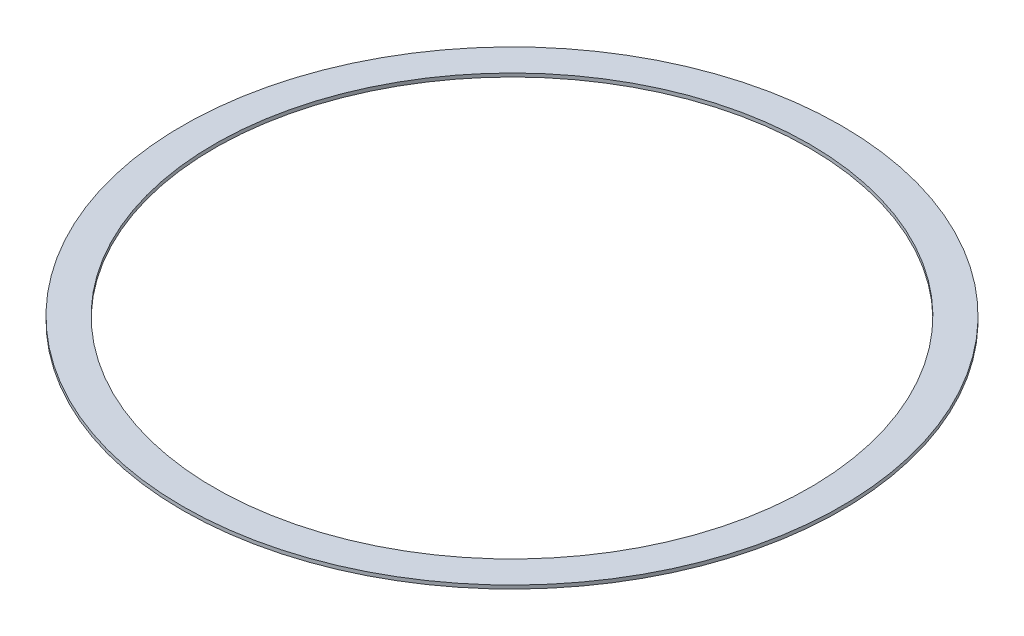
ISO-10303-21;
HEADER;
FILE_DESCRIPTION(('STEP AP214'),'2;1');
FILE_NAME('part.step','',(''),(''),'','','');
FILE_SCHEMA(('AUTOMOTIVE_DESIGN { 1 0 10303 214 1 1 1 1 }'));
ENDSEC;
DATA;
#1=APPLICATION_CONTEXT('core data for automotive mechanical design processes');
#2=APPLICATION_PROTOCOL_DEFINITION('international standard','automotive_design',2000,#1);
#3=PRODUCT_CONTEXT('',#1,'mechanical');
#4=PRODUCT('Part','Part','',(#3));
#5=PRODUCT_RELATED_PRODUCT_CATEGORY('part','',(#4));
#6=PRODUCT_DEFINITION_FORMATION('','',#4);
#7=PRODUCT_DEFINITION_CONTEXT('part definition',#1,'design');
#8=PRODUCT_DEFINITION('design','',#6,#7);
#9=PRODUCT_DEFINITION_SHAPE('','',#8);
#10=(LENGTH_UNIT() NAMED_UNIT(*) SI_UNIT(.MILLI.,.METRE.));
#11=(NAMED_UNIT(*) PLANE_ANGLE_UNIT() SI_UNIT($,.RADIAN.));
#12=(NAMED_UNIT(*) SI_UNIT($,.STERADIAN.) SOLID_ANGLE_UNIT());
#13=UNCERTAINTY_MEASURE_WITH_UNIT(LENGTH_MEASURE(1.E-05),#10,'distance_accuracy_value','');
#14=(GEOMETRIC_REPRESENTATION_CONTEXT(3) GLOBAL_UNCERTAINTY_ASSIGNED_CONTEXT((#13)) GLOBAL_UNIT_ASSIGNED_CONTEXT((#10,
#11,#12)) REPRESENTATION_CONTEXT('',''));
#15=CARTESIAN_POINT('',(0.,0.,0.));
#16=DIRECTION('',(0.,0.,1.));
#17=DIRECTION('',(1.,0.,0.));
#18=AXIS2_PLACEMENT_3D('',#15,#16,#17);
#19=CARTESIAN_POINT('',(0.,0.762,0.));
#20=DIRECTION('',(0.,1.,0.));
#21=DIRECTION('',(0.,0.,1.));
#22=AXIS2_PLACEMENT_3D('',#19,#20,#21);
#23=PLANE('',#22);
#24=CARTESIAN_POINT('',(0.,0.762,0.));
#25=DIRECTION('',(0.,1.,0.));
#26=DIRECTION('',(0.,0.,1.));
#27=AXIS2_PLACEMENT_3D('',#24,#25,#26);
#28=CIRCLE('',#27,72.0725);
#29=CARTESIAN_POINT('',(0.,0.762,-72.0725));
#30=VERTEX_POINT('',#29);
#31=EDGE_CURVE('E11',#30,#30,#28,.T.);
#32=ORIENTED_EDGE('',*,*,#31,.T.);
#33=EDGE_LOOP('',(#32));
#34=FACE_BOUND('',#33,.T.);
#35=CARTESIAN_POINT('',(0.,0.762,0.));
#36=DIRECTION('',(0.,1.,0.));
#37=DIRECTION('',(0.,0.,1.));
#38=AXIS2_PLACEMENT_3D('',#35,#36,#37);
#39=CIRCLE('',#38,65.0875);
#40=CARTESIAN_POINT('',(0.,0.762,-65.0875));
#41=VERTEX_POINT('',#40);
#42=EDGE_CURVE('E60',#41,#41,#39,.T.);
#43=ORIENTED_EDGE('',*,*,#42,.F.);
#44=EDGE_LOOP('',(#43));
#45=FACE_BOUND('',#44,.T.);
#46=ADVANCED_FACE('F47',(#34,#45),#23,.T.);
#47=CARTESIAN_POINT('',(0.,0.,0.));
#48=DIRECTION('',(0.,1.,0.));
#49=DIRECTION('',(0.,0.,1.));
#50=AXIS2_PLACEMENT_3D('',#47,#48,#49);
#51=PLANE('',#50);
#52=CARTESIAN_POINT('',(0.,0.,0.));
#53=DIRECTION('',(0.,1.,0.));
#54=DIRECTION('',(0.,0.,1.));
#55=AXIS2_PLACEMENT_3D('',#52,#53,#54);
#56=CIRCLE('',#55,72.0725);
#57=CARTESIAN_POINT('',(0.,0.,-72.0725));
#58=VERTEX_POINT('',#57);
#59=EDGE_CURVE('E51',#58,#58,#56,.T.);
#60=ORIENTED_EDGE('',*,*,#59,.F.);
#61=EDGE_LOOP('',(#60));
#62=FACE_BOUND('',#61,.T.);
#63=CARTESIAN_POINT('',(0.,0.,0.));
#64=DIRECTION('',(0.,1.,0.));
#65=DIRECTION('',(0.,0.,1.));
#66=AXIS2_PLACEMENT_3D('',#63,#64,#65);
#67=CIRCLE('',#66,65.0875);
#68=CARTESIAN_POINT('',(0.,0.,-65.0875));
#69=VERTEX_POINT('',#68);
#70=EDGE_CURVE('E62',#69,#69,#67,.T.);
#71=ORIENTED_EDGE('',*,*,#70,.T.);
#72=EDGE_LOOP('',(#71));
#73=FACE_BOUND('',#72,.T.);
#74=ADVANCED_FACE('F74',(#62,#73),#51,.F.);
#75=CARTESIAN_POINT('',(0.,0.762,0.));
#76=DIRECTION('',(0.,-1.,0.));
#77=DIRECTION('',(0.,0.,-1.));
#78=AXIS2_PLACEMENT_3D('',#75,#76,#77);
#79=CYLINDRICAL_SURFACE('',#78,72.0725);
#80=CARTESIAN_POINT('',(0.,0.762,-72.0725));
#81=CARTESIAN_POINT('',(0.,0.7540625,-72.0725));
#82=CARTESIAN_POINT('',(0.,0.746125,-72.0725));
#83=CARTESIAN_POINT('',(0.,0.73025,-72.0725));
#84=CARTESIAN_POINT('',(0.,0.7223125,-72.0725));
#85=CARTESIAN_POINT('',(0.,0.7064375,-72.0725));
#86=CARTESIAN_POINT('',(0.,0.6985,-72.0725));
#87=CARTESIAN_POINT('',(0.,0.682625,-72.0725));
#88=CARTESIAN_POINT('',(0.,0.6746875,-72.0725));
#89=CARTESIAN_POINT('',(0.,0.6588125,-72.0725));
#90=CARTESIAN_POINT('',(0.,0.650875,-72.0725));
#91=CARTESIAN_POINT('',(0.,0.635,-72.0725));
#92=CARTESIAN_POINT('',(0.,0.6270625,-72.0725));
#93=CARTESIAN_POINT('',(0.,0.6111875,-72.0725));
#94=CARTESIAN_POINT('',(0.,0.60325,-72.0725));
#95=CARTESIAN_POINT('',(0.,0.587375,-72.0725));
#96=CARTESIAN_POINT('',(0.,0.5794375,-72.0725));
#97=CARTESIAN_POINT('',(0.,0.5635625,-72.0725));
#98=CARTESIAN_POINT('',(0.,0.555625,-72.0725));
#99=CARTESIAN_POINT('',(0.,0.53975,-72.0725));
#100=CARTESIAN_POINT('',(0.,0.5318125,-72.0725));
#101=CARTESIAN_POINT('',(0.,0.5159375,-72.0725));
#102=CARTESIAN_POINT('',(0.,0.508,-72.0725));
#103=CARTESIAN_POINT('',(0.,0.492125,-72.0725));
#104=CARTESIAN_POINT('',(0.,0.4841875,-72.0725));
#105=CARTESIAN_POINT('',(0.,0.4683125,-72.0725));
#106=CARTESIAN_POINT('',(0.,0.460375,-72.0725));
#107=CARTESIAN_POINT('',(0.,0.4445,-72.0725));
#108=CARTESIAN_POINT('',(0.,0.4365625,-72.0725));
#109=CARTESIAN_POINT('',(0.,0.4206875,-72.0725));
#110=CARTESIAN_POINT('',(0.,0.41275,-72.0725));
#111=CARTESIAN_POINT('',(0.,0.396875,-72.0725));
#112=CARTESIAN_POINT('',(0.,0.3889375,-72.0725));
#113=CARTESIAN_POINT('',(0.,0.3730625,-72.0725));
#114=CARTESIAN_POINT('',(0.,0.365125,-72.0725));
#115=CARTESIAN_POINT('',(0.,0.34925,-72.0725));
#116=CARTESIAN_POINT('',(0.,0.3413125,-72.0725));
#117=CARTESIAN_POINT('',(0.,0.3254375,-72.0725));
#118=CARTESIAN_POINT('',(0.,0.3175,-72.0725));
#119=CARTESIAN_POINT('',(0.,0.301625,-72.0725));
#120=CARTESIAN_POINT('',(0.,0.2936875,-72.0725));
#121=CARTESIAN_POINT('',(0.,0.2778125,-72.0725));
#122=CARTESIAN_POINT('',(0.,0.269875,-72.0725));
#123=CARTESIAN_POINT('',(0.,0.254,-72.0725));
#124=CARTESIAN_POINT('',(0.,0.2460625,-72.0725));
#125=CARTESIAN_POINT('',(0.,0.2301875,-72.0725));
#126=CARTESIAN_POINT('',(0.,0.22225,-72.0725));
#127=CARTESIAN_POINT('',(0.,0.206375,-72.0725));
#128=CARTESIAN_POINT('',(0.,0.1984375,-72.0725));
#129=CARTESIAN_POINT('',(0.,0.1825625,-72.0725));
#130=CARTESIAN_POINT('',(0.,0.174625,-72.0725));
#131=CARTESIAN_POINT('',(0.,0.15875,-72.0725));
#132=CARTESIAN_POINT('',(0.,0.1508125,-72.0725));
#133=CARTESIAN_POINT('',(0.,0.1349375,-72.0725));
#134=CARTESIAN_POINT('',(0.,0.127,-72.0725));
#135=CARTESIAN_POINT('',(0.,0.111125,-72.0725));
#136=CARTESIAN_POINT('',(0.,0.1031875,-72.0725));
#137=CARTESIAN_POINT('',(0.,0.0873125,-72.0725));
#138=CARTESIAN_POINT('',(0.,0.079375,-72.0725));
#139=CARTESIAN_POINT('',(0.,0.0635,-72.0725));
#140=CARTESIAN_POINT('',(0.,0.0555625,-72.0725));
#141=CARTESIAN_POINT('',(0.,0.0396875,-72.0725));
#142=CARTESIAN_POINT('',(0.,0.03175,-72.0725));
#143=CARTESIAN_POINT('',(0.,0.015875,-72.0725));
#144=CARTESIAN_POINT('',(0.,0.00793749999999999,-72.0725));
#145=CARTESIAN_POINT('',(0.,0.,-72.0725));
#146=B_SPLINE_CURVE_WITH_KNOTS('',3,(#80,#81,#82,#83,#84,#85,#86,#87,#88,#89,#90,#91,#92,#93,
#94,#95,#96,#97,#98,#99,#100,#101,#102,#103,#104,#105,#106,#107,#108,#109,#110,#111,#112,#113,
#114,#115,#116,#117,#118,#119,#120,#121,#122,#123,#124,#125,#126,#127,#128,#129,#130,#131,#132,
#133,#134,#135,#136,#137,#138,#139,#140,#141,#142,#143,#144,#145),.UNSPECIFIED.,.F.,.F.,(4,2,2,
2,2,2,2,2,2,2,2,2,2,2,2,2,2,2,2,2,2,2,2,2,2,2,2,2,2,2,2,2,4),(0.,0.0238125000000001,0.047625,
0.0714375,0.0952500000000001,0.1190625,0.142875,0.1666875,0.1905,0.2143125,0.238125,0.2619375,
0.28575,0.3095625,0.333375,0.3571875,0.381,0.4048125,0.428625,0.4524375,0.47625,0.5000625,
0.523875,0.5476875,0.5715,0.5953125,0.619125,0.6429375,0.66675,0.6905625,0.714375,0.7381875,
0.762),.UNSPECIFIED.);
#147=EDGE_CURVE('BSEAM49',#30,#58,#146,.T.);
#148=ORIENTED_EDGE('',*,*,#31,.F.);
#149=ORIENTED_EDGE('',*,*,#59,.T.);
#150=ORIENTED_EDGE('',*,*,#147,.T.);
#151=ORIENTED_EDGE('',*,*,#147,.F.);
#152=EDGE_LOOP('',(#148,#150,#149,#151));
#153=FACE_BOUND('',#152,.T.);
#154=ADVANCED_FACE('F49',(#153),#79,.T.);
#155=CARTESIAN_POINT('',(0.,0.762,0.));
#156=DIRECTION('',(0.,-1.,0.));
#157=DIRECTION('',(0.,0.,-1.));
#158=AXIS2_PLACEMENT_3D('',#155,#156,#157);
#159=CYLINDRICAL_SURFACE('',#158,65.0875);
#160=CARTESIAN_POINT('',(0.,0.762,-65.0875));
#161=CARTESIAN_POINT('',(0.,0.7540625,-65.0875));
#162=CARTESIAN_POINT('',(0.,0.746125,-65.0875));
#163=CARTESIAN_POINT('',(0.,0.73025,-65.0875));
#164=CARTESIAN_POINT('',(0.,0.7223125,-65.0875));
#165=CARTESIAN_POINT('',(0.,0.7064375,-65.0875));
#166=CARTESIAN_POINT('',(0.,0.6985,-65.0875));
#167=CARTESIAN_POINT('',(0.,0.682625,-65.0875));
#168=CARTESIAN_POINT('',(0.,0.6746875,-65.0875));
#169=CARTESIAN_POINT('',(0.,0.6588125,-65.0875));
#170=CARTESIAN_POINT('',(0.,0.650875,-65.0875));
#171=CARTESIAN_POINT('',(0.,0.635,-65.0875));
#172=CARTESIAN_POINT('',(0.,0.6270625,-65.0875));
#173=CARTESIAN_POINT('',(0.,0.6111875,-65.0875));
#174=CARTESIAN_POINT('',(0.,0.60325,-65.0875));
#175=CARTESIAN_POINT('',(0.,0.587375,-65.0875));
#176=CARTESIAN_POINT('',(0.,0.5794375,-65.0875));
#177=CARTESIAN_POINT('',(0.,0.5635625,-65.0875));
#178=CARTESIAN_POINT('',(0.,0.555625,-65.0875));
#179=CARTESIAN_POINT('',(0.,0.53975,-65.0875));
#180=CARTESIAN_POINT('',(0.,0.5318125,-65.0875));
#181=CARTESIAN_POINT('',(0.,0.5159375,-65.0875));
#182=CARTESIAN_POINT('',(0.,0.508,-65.0875));
#183=CARTESIAN_POINT('',(0.,0.492125,-65.0875));
#184=CARTESIAN_POINT('',(0.,0.4841875,-65.0875));
#185=CARTESIAN_POINT('',(0.,0.4683125,-65.0875));
#186=CARTESIAN_POINT('',(0.,0.460375,-65.0875));
#187=CARTESIAN_POINT('',(0.,0.4445,-65.0875));
#188=CARTESIAN_POINT('',(0.,0.4365625,-65.0875));
#189=CARTESIAN_POINT('',(0.,0.4206875,-65.0875));
#190=CARTESIAN_POINT('',(0.,0.41275,-65.0875));
#191=CARTESIAN_POINT('',(0.,0.396875,-65.0875));
#192=CARTESIAN_POINT('',(0.,0.3889375,-65.0875));
#193=CARTESIAN_POINT('',(0.,0.3730625,-65.0875));
#194=CARTESIAN_POINT('',(0.,0.365125,-65.0875));
#195=CARTESIAN_POINT('',(0.,0.34925,-65.0875));
#196=CARTESIAN_POINT('',(0.,0.3413125,-65.0875));
#197=CARTESIAN_POINT('',(0.,0.3254375,-65.0875));
#198=CARTESIAN_POINT('',(0.,0.3175,-65.0875));
#199=CARTESIAN_POINT('',(0.,0.301625,-65.0875));
#200=CARTESIAN_POINT('',(0.,0.2936875,-65.0875));
#201=CARTESIAN_POINT('',(0.,0.2778125,-65.0875));
#202=CARTESIAN_POINT('',(0.,0.269875,-65.0875));
#203=CARTESIAN_POINT('',(0.,0.254,-65.0875));
#204=CARTESIAN_POINT('',(0.,0.2460625,-65.0875));
#205=CARTESIAN_POINT('',(0.,0.2301875,-65.0875));
#206=CARTESIAN_POINT('',(0.,0.22225,-65.0875));
#207=CARTESIAN_POINT('',(0.,0.206375,-65.0875));
#208=CARTESIAN_POINT('',(0.,0.1984375,-65.0875));
#209=CARTESIAN_POINT('',(0.,0.1825625,-65.0875));
#210=CARTESIAN_POINT('',(0.,0.174625,-65.0875));
#211=CARTESIAN_POINT('',(0.,0.15875,-65.0875));
#212=CARTESIAN_POINT('',(0.,0.1508125,-65.0875));
#213=CARTESIAN_POINT('',(0.,0.1349375,-65.0875));
#214=CARTESIAN_POINT('',(0.,0.127,-65.0875));
#215=CARTESIAN_POINT('',(0.,0.111125,-65.0875));
#216=CARTESIAN_POINT('',(0.,0.1031875,-65.0875));
#217=CARTESIAN_POINT('',(0.,0.0873125,-65.0875));
#218=CARTESIAN_POINT('',(0.,0.079375,-65.0875));
#219=CARTESIAN_POINT('',(0.,0.0635,-65.0875));
#220=CARTESIAN_POINT('',(0.,0.0555625,-65.0875));
#221=CARTESIAN_POINT('',(0.,0.0396875,-65.0875));
#222=CARTESIAN_POINT('',(0.,0.03175,-65.0875));
#223=CARTESIAN_POINT('',(0.,0.015875,-65.0875));
#224=CARTESIAN_POINT('',(0.,0.00793749999999999,-65.0875));
#225=CARTESIAN_POINT('',(0.,0.,-65.0875));
#226=B_SPLINE_CURVE_WITH_KNOTS('',3,(#160,#161,#162,#163,#164,#165,#166,#167,#168,#169,#170,
#171,#172,#173,#174,#175,#176,#177,#178,#179,#180,#181,#182,#183,#184,#185,#186,#187,#188,#189,
#190,#191,#192,#193,#194,#195,#196,#197,#198,#199,#200,#201,#202,#203,#204,#205,#206,#207,#208,
#209,#210,#211,#212,#213,#214,#215,#216,#217,#218,#219,#220,#221,#222,#223,#224,#225),
.UNSPECIFIED.,.F.,.F.,(4,2,2,2,2,2,2,2,2,2,2,2,2,2,2,2,2,2,2,2,2,2,2,2,2,2,2,2,2,2,2,2,4),(0.,
0.0238125,0.0476249999999999,0.0714374999999999,0.09525,0.1190625,0.142875,0.1666875,0.1905,
0.2143125,0.238125,0.2619375,0.28575,0.3095625,0.333375,0.3571875,0.381,0.4048125,0.428625,
0.4524375,0.47625,0.5000625,0.523875,0.5476875,0.5715,0.5953125,0.619125,0.6429375,0.66675,
0.6905625,0.714375,0.7381875,0.762),.UNSPECIFIED.);
#227=EDGE_CURVE('BSEAM70',#41,#69,#226,.T.);
#228=ORIENTED_EDGE('',*,*,#42,.T.);
#229=ORIENTED_EDGE('',*,*,#70,.F.);
#230=ORIENTED_EDGE('',*,*,#227,.T.);
#231=ORIENTED_EDGE('',*,*,#227,.F.);
#232=EDGE_LOOP('',(#228,#230,#229,#231));
#233=FACE_BOUND('',#232,.T.);
#234=ADVANCED_FACE('F70',(#233),#159,.F.);
#235=CLOSED_SHELL('',(#46,#74,#154,#234));
#236=MANIFOLD_SOLID_BREP('B2',#235);
#237=ADVANCED_BREP_SHAPE_REPRESENTATION('',(#18,#236),#14);
#238=SHAPE_DEFINITION_REPRESENTATION(#9,#237);
ENDSEC;
END-ISO-10303-21;
